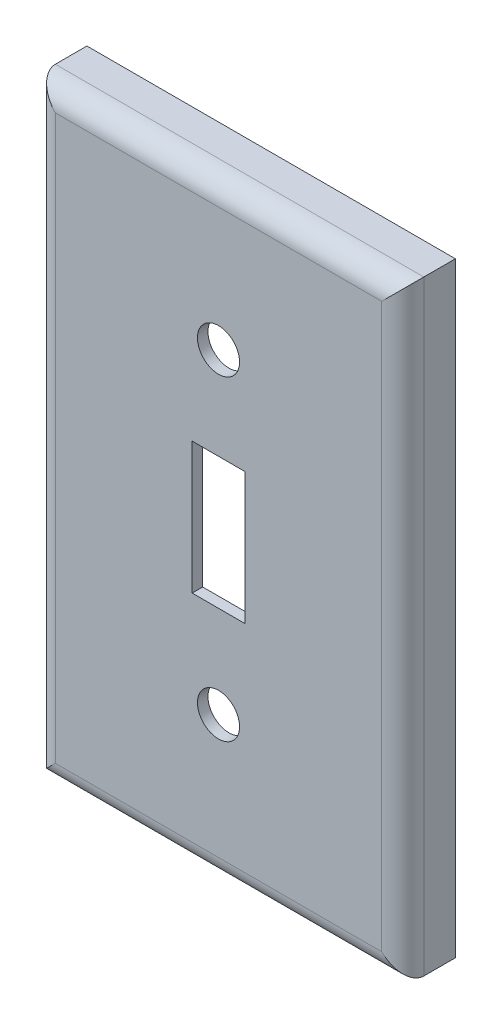
ISO-10303-21;
HEADER;
FILE_DESCRIPTION(('STEP AP214'),'2;1');
FILE_NAME('part.step','',(''),(''),'','','');
FILE_SCHEMA(('AUTOMOTIVE_DESIGN { 1 0 10303 214 1 1 1 1 }'));
ENDSEC;
DATA;
#1=APPLICATION_CONTEXT('core data for automotive mechanical design processes');
#2=APPLICATION_PROTOCOL_DEFINITION('international standard','automotive_design',2000,#1);
#3=PRODUCT_CONTEXT('',#1,'mechanical');
#4=PRODUCT('Part','Part','',(#3));
#5=PRODUCT_RELATED_PRODUCT_CATEGORY('part','',(#4));
#6=PRODUCT_DEFINITION_FORMATION('','',#4);
#7=PRODUCT_DEFINITION_CONTEXT('part definition',#1,'design');
#8=PRODUCT_DEFINITION('design','',#6,#7);
#9=PRODUCT_DEFINITION_SHAPE('','',#8);
#10=(LENGTH_UNIT() NAMED_UNIT(*) SI_UNIT(.MILLI.,.METRE.));
#11=(NAMED_UNIT(*) PLANE_ANGLE_UNIT() SI_UNIT($,.RADIAN.));
#12=(NAMED_UNIT(*) SI_UNIT($,.STERADIAN.) SOLID_ANGLE_UNIT());
#13=UNCERTAINTY_MEASURE_WITH_UNIT(LENGTH_MEASURE(1.E-05),#10,'distance_accuracy_value','');
#14=(GEOMETRIC_REPRESENTATION_CONTEXT(3) GLOBAL_UNCERTAINTY_ASSIGNED_CONTEXT((#13)) GLOBAL_UNIT_ASSIGNED_CONTEXT((#10,
#11,#12)) REPRESENTATION_CONTEXT('',''));
#15=CARTESIAN_POINT('',(0.,0.,0.));
#16=DIRECTION('',(0.,0.,1.));
#17=DIRECTION('',(1.,0.,0.));
#18=AXIS2_PLACEMENT_3D('',#15,#16,#17);
#19=CARTESIAN_POINT('',(0.,0.,0.));
#20=DIRECTION('',(0.,0.,-1.));
#21=DIRECTION('',(-1.,0.,0.));
#22=AXIS2_PLACEMENT_3D('',#19,#20,#21);
#23=PLANE('',#22);
#24=DIRECTION('',(0.,-1.,0.));
#25=VECTOR('',#24,1.);
#26=CARTESIAN_POINT('',(0.,0.,0.));
#27=LINE('',#26,#25);
#28=CARTESIAN_POINT('',(0.,115.,0.));
#29=VERTEX_POINT('',#28);
#30=CARTESIAN_POINT('',(0.,0.,0.));
#31=VERTEX_POINT('',#30);
#32=EDGE_CURVE('E231',#29,#31,#27,.T.);
#33=ORIENTED_EDGE('',*,*,#32,.F.);
#34=DIRECTION('',(-1.,0.,0.));
#35=VECTOR('',#34,1.);
#36=CARTESIAN_POINT('',(0.,115.,0.));
#37=LINE('',#36,#35);
#38=CARTESIAN_POINT('',(70.,115.,0.));
#39=VERTEX_POINT('',#38);
#40=EDGE_CURVE('E241',#39,#29,#37,.T.);
#41=ORIENTED_EDGE('',*,*,#40,.F.);
#42=DIRECTION('',(0.,1.,0.));
#43=VECTOR('',#42,1.);
#44=CARTESIAN_POINT('',(70.,0.,0.));
#45=LINE('',#44,#43);
#46=CARTESIAN_POINT('',(70.,0.,0.));
#47=VERTEX_POINT('',#46);
#48=EDGE_CURVE('E238',#47,#39,#45,.T.);
#49=ORIENTED_EDGE('',*,*,#48,.F.);
#50=DIRECTION('',(1.,0.,0.));
#51=VECTOR('',#50,1.);
#52=CARTESIAN_POINT('',(0.,0.,0.));
#53=LINE('',#52,#51);
#54=EDGE_CURVE('E234',#31,#47,#53,.T.);
#55=ORIENTED_EDGE('',*,*,#54,.F.);
#56=EDGE_LOOP('',(#33,#41,#49,#55));
#57=FACE_BOUND('',#56,.T.);
#58=DIRECTION('',(-1.,0.,0.));
#59=VECTOR('',#58,1.);
#60=CARTESIAN_POINT('',(0.,113.,0.));
#61=LINE('',#60,#59);
#62=CARTESIAN_POINT('',(68.,113.,0.));
#63=VERTEX_POINT('',#62);
#64=CARTESIAN_POINT('',(1.99999999999996,113.,0.));
#65=VERTEX_POINT('',#64);
#66=EDGE_CURVE('E192',#63,#65,#61,.T.);
#67=ORIENTED_EDGE('',*,*,#66,.T.);
#68=DIRECTION('',(0.,-1.,0.));
#69=VECTOR('',#68,1.);
#70=CARTESIAN_POINT('',(2.,0.,0.));
#71=LINE('',#70,#69);
#72=CARTESIAN_POINT('',(2.,2.,0.));
#73=VERTEX_POINT('',#72);
#74=EDGE_CURVE('E206',#65,#73,#71,.T.);
#75=ORIENTED_EDGE('',*,*,#74,.T.);
#76=DIRECTION('',(1.,0.,0.));
#77=VECTOR('',#76,1.);
#78=CARTESIAN_POINT('',(0.,2.,0.));
#79=LINE('',#78,#77);
#80=CARTESIAN_POINT('',(68.,2.,0.));
#81=VERTEX_POINT('',#80);
#82=EDGE_CURVE('E223',#73,#81,#79,.T.);
#83=ORIENTED_EDGE('',*,*,#82,.T.);
#84=DIRECTION('',(0.,1.,0.));
#85=VECTOR('',#84,1.);
#86=CARTESIAN_POINT('',(68.,0.,0.));
#87=LINE('',#86,#85);
#88=EDGE_CURVE('E226',#81,#63,#87,.T.);
#89=ORIENTED_EDGE('',*,*,#88,.T.);
#90=EDGE_LOOP('',(#67,#75,#83,#89));
#91=FACE_BOUND('',#90,.T.);
#92=ADVANCED_FACE('F33',(#57,#91),#23,.T.);
#93=CARTESIAN_POINT('',(0.,0.,10.));
#94=DIRECTION('',(1.,0.,0.));
#95=DIRECTION('',(0.,1.,0.));
#96=AXIS2_PLACEMENT_3D('',#93,#94,#95);
#97=PLANE('',#96);
#98=DIRECTION('',(0.,0.,-1.));
#99=VECTOR('',#98,1.);
#100=CARTESIAN_POINT('',(0.,0.,10.));
#101=LINE('',#100,#99);
#102=CARTESIAN_POINT('',(0.,0.,6.));
#103=VERTEX_POINT('',#102);
#104=EDGE_CURVE('E250',#103,#31,#101,.T.);
#105=ORIENTED_EDGE('',*,*,#104,.F.);
#106=DIRECTION('',(0.,-1.,0.));
#107=VECTOR('',#106,1.);
#108=CARTESIAN_POINT('',(0.,0.,6.));
#109=LINE('',#108,#107);
#110=CARTESIAN_POINT('',(0.,115.,6.));
#111=VERTEX_POINT('',#110);
#112=EDGE_CURVE('E268',#103,#111,#109,.F.);
#113=ORIENTED_EDGE('',*,*,#112,.T.);
#114=DIRECTION('',(0.,0.,-1.));
#115=VECTOR('',#114,1.);
#116=CARTESIAN_POINT('',(0.,115.,10.));
#117=LINE('',#116,#115);
#118=EDGE_CURVE('E244',#111,#29,#117,.T.);
#119=ORIENTED_EDGE('',*,*,#118,.T.);
#120=ORIENTED_EDGE('',*,*,#32,.T.);
#121=EDGE_LOOP('',(#105,#113,#119,#120));
#122=FACE_BOUND('',#121,.T.);
#123=ADVANCED_FACE('F306',(#122),#97,.F.);
#124=CARTESIAN_POINT('',(0.,0.,10.));
#125=DIRECTION('',(0.,1.,0.));
#126=DIRECTION('',(0.,0.,1.));
#127=AXIS2_PLACEMENT_3D('',#124,#125,#126);
#128=PLANE('',#127);
#129=DIRECTION('',(0.,0.,-1.));
#130=VECTOR('',#129,1.);
#131=CARTESIAN_POINT('',(70.,0.,10.));
#132=LINE('',#131,#130);
#133=CARTESIAN_POINT('',(70.,0.,6.));
#134=VERTEX_POINT('',#133);
#135=EDGE_CURVE('E248',#134,#47,#132,.T.);
#136=ORIENTED_EDGE('',*,*,#135,.F.);
#137=DIRECTION('',(1.,0.,0.));
#138=VECTOR('',#137,1.);
#139=CARTESIAN_POINT('',(0.,0.,6.));
#140=LINE('',#139,#138);
#141=EDGE_CURVE('E266',#134,#103,#140,.F.);
#142=ORIENTED_EDGE('',*,*,#141,.T.);
#143=ORIENTED_EDGE('',*,*,#104,.T.);
#144=ORIENTED_EDGE('',*,*,#54,.T.);
#145=EDGE_LOOP('',(#136,#142,#143,#144));
#146=FACE_BOUND('',#145,.T.);
#147=ADVANCED_FACE('F312',(#146),#128,.F.);
#148=CARTESIAN_POINT('',(70.,0.,10.));
#149=DIRECTION('',(-1.,0.,0.));
#150=DIRECTION('',(0.,-1.,0.));
#151=AXIS2_PLACEMENT_3D('',#148,#149,#150);
#152=PLANE('',#151);
#153=DIRECTION('',(0.,0.,-1.));
#154=VECTOR('',#153,1.);
#155=CARTESIAN_POINT('',(70.,115.,10.));
#156=LINE('',#155,#154);
#157=CARTESIAN_POINT('',(70.,115.,6.));
#158=VERTEX_POINT('',#157);
#159=EDGE_CURVE('E246',#158,#39,#156,.T.);
#160=ORIENTED_EDGE('',*,*,#159,.F.);
#161=DIRECTION('',(0.,1.,0.));
#162=VECTOR('',#161,1.);
#163=CARTESIAN_POINT('',(70.,0.,6.));
#164=LINE('',#163,#162);
#165=EDGE_CURVE('E264',#158,#134,#164,.F.);
#166=ORIENTED_EDGE('',*,*,#165,.T.);
#167=ORIENTED_EDGE('',*,*,#135,.T.);
#168=ORIENTED_EDGE('',*,*,#48,.T.);
#169=EDGE_LOOP('',(#160,#166,#167,#168));
#170=FACE_BOUND('',#169,.T.);
#171=ADVANCED_FACE('F323',(#170),#152,.F.);
#172=CARTESIAN_POINT('',(0.,115.,10.));
#173=DIRECTION('',(0.,-1.,0.));
#174=DIRECTION('',(0.,0.,-1.));
#175=AXIS2_PLACEMENT_3D('',#172,#173,#174);
#176=PLANE('',#175);
#177=ORIENTED_EDGE('',*,*,#118,.F.);
#178=DIRECTION('',(-1.,0.,0.));
#179=VECTOR('',#178,1.);
#180=CARTESIAN_POINT('',(0.,115.,6.));
#181=LINE('',#180,#179);
#182=EDGE_CURVE('E261',#111,#158,#181,.F.);
#183=ORIENTED_EDGE('',*,*,#182,.T.);
#184=ORIENTED_EDGE('',*,*,#159,.T.);
#185=ORIENTED_EDGE('',*,*,#40,.T.);
#186=EDGE_LOOP('',(#177,#183,#184,#185));
#187=FACE_BOUND('',#186,.T.);
#188=ADVANCED_FACE('F320',(#187),#176,.F.);
#189=CARTESIAN_POINT('',(0.,0.,10.));
#190=DIRECTION('',(0.,0.,-1.));
#191=DIRECTION('',(-1.,0.,0.));
#192=AXIS2_PLACEMENT_3D('',#189,#190,#191);
#193=PLANE('',#192);
#194=DIRECTION('',(1.,0.,0.));
#195=VECTOR('',#194,1.);
#196=CARTESIAN_POINT('',(30.,45.,10.));
#197=LINE('',#196,#195);
#198=CARTESIAN_POINT('',(30.,45.,10.));
#199=VERTEX_POINT('',#198);
#200=CARTESIAN_POINT('',(40.,45.,10.));
#201=VERTEX_POINT('',#200);
#202=EDGE_CURVE('E157',#199,#201,#197,.T.);
#203=ORIENTED_EDGE('',*,*,#202,.F.);
#204=DIRECTION('',(0.,-1.,0.));
#205=VECTOR('',#204,1.);
#206=CARTESIAN_POINT('',(30.,70.,10.));
#207=LINE('',#206,#205);
#208=CARTESIAN_POINT('',(30.,70.,10.));
#209=VERTEX_POINT('',#208);
#210=EDGE_CURVE('E48',#209,#199,#207,.T.);
#211=ORIENTED_EDGE('',*,*,#210,.F.);
#212=DIRECTION('',(-1.,0.,0.));
#213=VECTOR('',#212,1.);
#214=CARTESIAN_POINT('',(30.,70.,10.));
#215=LINE('',#214,#213);
#216=CARTESIAN_POINT('',(40.,70.,10.));
#217=VERTEX_POINT('',#216);
#218=EDGE_CURVE('E164',#217,#209,#215,.T.);
#219=ORIENTED_EDGE('',*,*,#218,.F.);
#220=DIRECTION('',(0.,1.,0.));
#221=VECTOR('',#220,1.);
#222=CARTESIAN_POINT('',(40.,70.,10.));
#223=LINE('',#222,#221);
#224=EDGE_CURVE('E148',#201,#217,#223,.T.);
#225=ORIENTED_EDGE('',*,*,#224,.F.);
#226=EDGE_LOOP('',(#203,#211,#219,#225));
#227=FACE_BOUND('',#226,.T.);
#228=CARTESIAN_POINT('',(35.,27.5,10.));
#229=DIRECTION('',(0.,0.,1.));
#230=DIRECTION('',(1.,0.,0.));
#231=AXIS2_PLACEMENT_3D('',#228,#229,#230);
#232=CIRCLE('',#231,4.00000000000001);
#233=CARTESIAN_POINT('',(39.,27.5,10.));
#234=VERTEX_POINT('',#233);
#235=EDGE_CURVE('E171',#234,#234,#232,.T.);
#236=ORIENTED_EDGE('',*,*,#235,.F.);
#237=EDGE_LOOP('',(#236));
#238=FACE_BOUND('',#237,.T.);
#239=CARTESIAN_POINT('',(35.,87.5,10.));
#240=DIRECTION('',(0.,0.,1.));
#241=DIRECTION('',(1.,0.,0.));
#242=AXIS2_PLACEMENT_3D('',#239,#240,#241);
#243=CIRCLE('',#242,4.00000000000001);
#244=CARTESIAN_POINT('',(39.,87.5,10.));
#245=VERTEX_POINT('',#244);
#246=EDGE_CURVE('E177',#245,#245,#243,.T.);
#247=ORIENTED_EDGE('',*,*,#246,.F.);
#248=EDGE_LOOP('',(#247));
#249=FACE_BOUND('',#248,.T.);
#250=DIRECTION('',(0.,1.,0.));
#251=VECTOR('',#250,1.);
#252=CARTESIAN_POINT('',(66.,0.,10.));
#253=LINE('',#252,#251);
#254=CARTESIAN_POINT('',(66.,4.,10.));
#255=VERTEX_POINT('',#254);
#256=CARTESIAN_POINT('',(66.,111.,10.));
#257=VERTEX_POINT('',#256);
#258=EDGE_CURVE('E256',#255,#257,#253,.T.);
#259=ORIENTED_EDGE('',*,*,#258,.T.);
#260=DIRECTION('',(-1.,0.,0.));
#261=VECTOR('',#260,1.);
#262=CARTESIAN_POINT('',(0.,111.,10.));
#263=LINE('',#262,#261);
#264=CARTESIAN_POINT('',(3.99999999999996,111.,10.));
#265=VERTEX_POINT('',#264);
#266=EDGE_CURVE('E258',#257,#265,#263,.T.);
#267=ORIENTED_EDGE('',*,*,#266,.T.);
#268=DIRECTION('',(0.,-1.,0.));
#269=VECTOR('',#268,1.);
#270=CARTESIAN_POINT('',(4.,0.,10.));
#271=LINE('',#270,#269);
#272=CARTESIAN_POINT('',(4.,4.,10.));
#273=VERTEX_POINT('',#272);
#274=EDGE_CURVE('E252',#265,#273,#271,.T.);
#275=ORIENTED_EDGE('',*,*,#274,.T.);
#276=DIRECTION('',(1.,0.,0.));
#277=VECTOR('',#276,1.);
#278=CARTESIAN_POINT('',(0.,4.,10.));
#279=LINE('',#278,#277);
#280=EDGE_CURVE('E254',#273,#255,#279,.T.);
#281=ORIENTED_EDGE('',*,*,#280,.T.);
#282=EDGE_LOOP('',(#259,#267,#275,#281));
#283=FACE_BOUND('',#282,.T.);
#284=ADVANCED_FACE('F161',(#227,#238,#249,#283),#193,.F.);
#285=CARTESIAN_POINT('',(0.,4.,6.));
#286=DIRECTION('',(1.,0.,0.));
#287=DIRECTION('',(0.,0.,-1.));
#288=AXIS2_PLACEMENT_3D('',#285,#286,#287);
#289=CYLINDRICAL_SURFACE('',#288,4.);
#290=CARTESIAN_POINT('',(4.,4.,6.));
#291=DIRECTION('',(0.707106781186548,-0.707106781186547,0.));
#292=DIRECTION('',(-0.707106781186547,-0.707106781186548,0.));
#293=AXIS2_PLACEMENT_3D('',#290,#291,#292);
#294=ELLIPSE('',#293,5.65685424949238,4.);
#295=EDGE_CURVE('E274',#103,#273,#294,.F.);
#296=ORIENTED_EDGE('',*,*,#295,.F.);
#297=ORIENTED_EDGE('',*,*,#141,.F.);
#298=CARTESIAN_POINT('',(66.,4.,6.));
#299=DIRECTION('',(0.707106781186547,0.707106781186548,0.));
#300=DIRECTION('',(0.707106781186548,-0.707106781186547,0.));
#301=AXIS2_PLACEMENT_3D('',#298,#299,#300);
#302=ELLIPSE('',#301,5.65685424949238,4.);
#303=EDGE_CURVE('E235',#255,#134,#302,.T.);
#304=ORIENTED_EDGE('',*,*,#303,.F.);
#305=ORIENTED_EDGE('',*,*,#280,.F.);
#306=EDGE_LOOP('',(#296,#297,#304,#305));
#307=FACE_BOUND('',#306,.T.);
#308=ADVANCED_FACE('F35',(#307),#289,.T.);
#309=CARTESIAN_POINT('',(66.,0.,6.));
#310=DIRECTION('',(0.,1.,0.));
#311=DIRECTION('',(-1.,0.,0.));
#312=AXIS2_PLACEMENT_3D('',#309,#310,#311);
#313=CYLINDRICAL_SURFACE('',#312,4.);
#314=ORIENTED_EDGE('',*,*,#303,.T.);
#315=ORIENTED_EDGE('',*,*,#165,.F.);
#316=CARTESIAN_POINT('',(66.,111.,6.));
#317=DIRECTION('',(-0.707106781186548,0.707106781186547,0.));
#318=DIRECTION('',(0.707106781186547,0.707106781186548,0.));
#319=AXIS2_PLACEMENT_3D('',#316,#317,#318);
#320=ELLIPSE('',#319,5.65685424949238,4.);
#321=EDGE_CURVE('E272',#257,#158,#320,.T.);
#322=ORIENTED_EDGE('',*,*,#321,.F.);
#323=ORIENTED_EDGE('',*,*,#258,.F.);
#324=EDGE_LOOP('',(#314,#315,#322,#323));
#325=FACE_BOUND('',#324,.T.);
#326=ADVANCED_FACE('F338',(#325),#313,.T.);
#327=CARTESIAN_POINT('',(4.,0.,6.));
#328=DIRECTION('',(0.,-1.,0.));
#329=DIRECTION('',(1.,0.,0.));
#330=AXIS2_PLACEMENT_3D('',#327,#328,#329);
#331=CYLINDRICAL_SURFACE('',#330,4.);
#332=ORIENTED_EDGE('',*,*,#295,.T.);
#333=ORIENTED_EDGE('',*,*,#274,.F.);
#334=CARTESIAN_POINT('',(3.99999999999996,111.,6.));
#335=DIRECTION('',(-0.707106781186547,-0.707106781186548,0.));
#336=DIRECTION('',(0.707106781186548,-0.707106781186547,0.));
#337=AXIS2_PLACEMENT_3D('',#334,#335,#336);
#338=ELLIPSE('',#337,5.65685424949238,4.);
#339=EDGE_CURVE('E187',#111,#265,#338,.F.);
#340=ORIENTED_EDGE('',*,*,#339,.F.);
#341=ORIENTED_EDGE('',*,*,#112,.F.);
#342=EDGE_LOOP('',(#332,#333,#340,#341));
#343=FACE_BOUND('',#342,.T.);
#344=ADVANCED_FACE('F335',(#343),#331,.T.);
#345=CARTESIAN_POINT('',(0.,111.,6.));
#346=DIRECTION('',(-1.,0.,0.));
#347=DIRECTION('',(0.,0.,1.));
#348=AXIS2_PLACEMENT_3D('',#345,#346,#347);
#349=CYLINDRICAL_SURFACE('',#348,4.);
#350=ORIENTED_EDGE('',*,*,#321,.T.);
#351=ORIENTED_EDGE('',*,*,#182,.F.);
#352=ORIENTED_EDGE('',*,*,#339,.T.);
#353=ORIENTED_EDGE('',*,*,#266,.F.);
#354=EDGE_LOOP('',(#350,#351,#352,#353));
#355=FACE_BOUND('',#354,.T.);
#356=ADVANCED_FACE('F331',(#355),#349,.T.);
#357=CARTESIAN_POINT('',(2.,0.,10.));
#358=DIRECTION('',(1.,0.,0.));
#359=DIRECTION('',(0.,1.,0.));
#360=AXIS2_PLACEMENT_3D('',#357,#358,#359);
#361=PLANE('',#360);
#362=DIRECTION('',(0.,0.,-1.));
#363=VECTOR('',#362,1.);
#364=CARTESIAN_POINT('',(2.,2.,10.));
#365=LINE('',#364,#363);
#366=CARTESIAN_POINT('',(2.,2.,6.));
#367=VERTEX_POINT('',#366);
#368=EDGE_CURVE('E181',#367,#73,#365,.T.);
#369=ORIENTED_EDGE('',*,*,#368,.T.);
#370=ORIENTED_EDGE('',*,*,#74,.F.);
#371=DIRECTION('',(0.,0.,-1.));
#372=VECTOR('',#371,1.);
#373=CARTESIAN_POINT('',(1.99999999999996,113.,10.));
#374=LINE('',#373,#372);
#375=CARTESIAN_POINT('',(1.99999999999996,113.,6.));
#376=VERTEX_POINT('',#375);
#377=EDGE_CURVE('E189',#376,#65,#374,.T.);
#378=ORIENTED_EDGE('',*,*,#377,.F.);
#379=DIRECTION('',(0.,1.,0.));
#380=VECTOR('',#379,1.);
#381=CARTESIAN_POINT('',(2.,0.,6.));
#382=LINE('',#381,#380);
#383=EDGE_CURVE('E185',#367,#376,#382,.T.);
#384=ORIENTED_EDGE('',*,*,#383,.F.);
#385=EDGE_LOOP('',(#369,#370,#378,#384));
#386=FACE_BOUND('',#385,.T.);
#387=ADVANCED_FACE('F334',(#386),#361,.T.);
#388=CARTESIAN_POINT('',(0.,2.,10.));
#389=DIRECTION('',(0.,1.,0.));
#390=DIRECTION('',(0.,0.,1.));
#391=AXIS2_PLACEMENT_3D('',#388,#389,#390);
#392=PLANE('',#391);
#393=DIRECTION('',(0.,0.,-1.));
#394=VECTOR('',#393,1.);
#395=CARTESIAN_POINT('',(68.,2.,10.));
#396=LINE('',#395,#394);
#397=CARTESIAN_POINT('',(68.,2.,6.));
#398=VERTEX_POINT('',#397);
#399=EDGE_CURVE('E184',#398,#81,#396,.T.);
#400=ORIENTED_EDGE('',*,*,#399,.T.);
#401=ORIENTED_EDGE('',*,*,#82,.F.);
#402=ORIENTED_EDGE('',*,*,#368,.F.);
#403=DIRECTION('',(1.,0.,0.));
#404=VECTOR('',#403,1.);
#405=CARTESIAN_POINT('',(0.,2.,6.));
#406=LINE('',#405,#404);
#407=EDGE_CURVE('E188',#398,#367,#406,.F.);
#408=ORIENTED_EDGE('',*,*,#407,.F.);
#409=EDGE_LOOP('',(#400,#401,#402,#408));
#410=FACE_BOUND('',#409,.T.);
#411=ADVANCED_FACE('F409',(#410),#392,.T.);
#412=CARTESIAN_POINT('',(68.,0.,10.));
#413=DIRECTION('',(-1.,0.,0.));
#414=DIRECTION('',(0.,-1.,0.));
#415=AXIS2_PLACEMENT_3D('',#412,#413,#414);
#416=PLANE('',#415);
#417=DIRECTION('',(0.,0.,-1.));
#418=VECTOR('',#417,1.);
#419=CARTESIAN_POINT('',(68.,113.,10.));
#420=LINE('',#419,#418);
#421=CARTESIAN_POINT('',(68.,113.,6.));
#422=VERTEX_POINT('',#421);
#423=EDGE_CURVE('E191',#422,#63,#420,.T.);
#424=ORIENTED_EDGE('',*,*,#423,.T.);
#425=ORIENTED_EDGE('',*,*,#88,.F.);
#426=ORIENTED_EDGE('',*,*,#399,.F.);
#427=DIRECTION('',(0.,-1.,0.));
#428=VECTOR('',#427,1.);
#429=CARTESIAN_POINT('',(68.,0.,6.));
#430=LINE('',#429,#428);
#431=EDGE_CURVE('E196',#422,#398,#430,.T.);
#432=ORIENTED_EDGE('',*,*,#431,.F.);
#433=EDGE_LOOP('',(#424,#425,#426,#432));
#434=FACE_BOUND('',#433,.T.);
#435=ADVANCED_FACE('F419',(#434),#416,.T.);
#436=CARTESIAN_POINT('',(0.,113.,10.));
#437=DIRECTION('',(0.,-1.,0.));
#438=DIRECTION('',(0.,0.,-1.));
#439=AXIS2_PLACEMENT_3D('',#436,#437,#438);
#440=PLANE('',#439);
#441=ORIENTED_EDGE('',*,*,#377,.T.);
#442=ORIENTED_EDGE('',*,*,#66,.F.);
#443=ORIENTED_EDGE('',*,*,#423,.F.);
#444=DIRECTION('',(1.,0.,0.));
#445=VECTOR('',#444,1.);
#446=CARTESIAN_POINT('',(0.,113.,6.));
#447=LINE('',#446,#445);
#448=EDGE_CURVE('E199',#376,#422,#447,.T.);
#449=ORIENTED_EDGE('',*,*,#448,.F.);
#450=EDGE_LOOP('',(#441,#442,#443,#449));
#451=FACE_BOUND('',#450,.T.);
#452=ADVANCED_FACE('F429',(#451),#440,.T.);
#453=CARTESIAN_POINT('',(0.,0.,8.));
#454=DIRECTION('',(0.,0.,-1.));
#455=DIRECTION('',(-1.,0.,0.));
#456=AXIS2_PLACEMENT_3D('',#453,#454,#455);
#457=PLANE('',#456);
#458=DIRECTION('',(0.,1.,0.));
#459=VECTOR('',#458,1.);
#460=CARTESIAN_POINT('',(30.,0.,8.));
#461=LINE('',#460,#459);
#462=CARTESIAN_POINT('',(30.,45.,8.));
#463=VERTEX_POINT('',#462);
#464=CARTESIAN_POINT('',(30.,70.,8.));
#465=VERTEX_POINT('',#464);
#466=EDGE_CURVE('E11',#463,#465,#461,.T.);
#467=ORIENTED_EDGE('',*,*,#466,.F.);
#468=DIRECTION('',(-1.,0.,0.));
#469=VECTOR('',#468,1.);
#470=CARTESIAN_POINT('',(0.,45.,8.));
#471=LINE('',#470,#469);
#472=CARTESIAN_POINT('',(40.,45.,8.));
#473=VERTEX_POINT('',#472);
#474=EDGE_CURVE('E270',#473,#463,#471,.T.);
#475=ORIENTED_EDGE('',*,*,#474,.F.);
#476=DIRECTION('',(0.,-1.,0.));
#477=VECTOR('',#476,1.);
#478=CARTESIAN_POINT('',(40.,0.,8.));
#479=LINE('',#478,#477);
#480=CARTESIAN_POINT('',(40.,70.,8.));
#481=VERTEX_POINT('',#480);
#482=EDGE_CURVE('E151',#481,#473,#479,.T.);
#483=ORIENTED_EDGE('',*,*,#482,.F.);
#484=DIRECTION('',(1.,0.,0.));
#485=VECTOR('',#484,1.);
#486=CARTESIAN_POINT('',(0.,70.,8.));
#487=LINE('',#486,#485);
#488=EDGE_CURVE('E41',#465,#481,#487,.T.);
#489=ORIENTED_EDGE('',*,*,#488,.F.);
#490=EDGE_LOOP('',(#467,#475,#483,#489));
#491=FACE_BOUND('',#490,.T.);
#492=CARTESIAN_POINT('',(35.,27.5,8.));
#493=DIRECTION('',(0.,0.,-1.));
#494=DIRECTION('',(-1.,0.,0.));
#495=AXIS2_PLACEMENT_3D('',#492,#493,#494);
#496=CIRCLE('',#495,4.00000000000001);
#497=CARTESIAN_POINT('',(31.,27.5,8.));
#498=VERTEX_POINT('',#497);
#499=EDGE_CURVE('E176',#498,#498,#496,.T.);
#500=ORIENTED_EDGE('',*,*,#499,.F.);
#501=EDGE_LOOP('',(#500));
#502=FACE_BOUND('',#501,.T.);
#503=CARTESIAN_POINT('',(35.,87.5,8.));
#504=DIRECTION('',(0.,0.,-1.));
#505=DIRECTION('',(-1.,0.,0.));
#506=AXIS2_PLACEMENT_3D('',#503,#504,#505);
#507=CIRCLE('',#506,4.00000000000001);
#508=CARTESIAN_POINT('',(31.,87.5,8.));
#509=VERTEX_POINT('',#508);
#510=EDGE_CURVE('E180',#509,#509,#507,.T.);
#511=ORIENTED_EDGE('',*,*,#510,.F.);
#512=EDGE_LOOP('',(#511));
#513=FACE_BOUND('',#512,.T.);
#514=DIRECTION('',(0.,1.,0.));
#515=VECTOR('',#514,1.);
#516=CARTESIAN_POINT('',(66.,0.,8.));
#517=LINE('',#516,#515);
#518=CARTESIAN_POINT('',(66.,4.,8.));
#519=VERTEX_POINT('',#518);
#520=CARTESIAN_POINT('',(66.,111.,8.));
#521=VERTEX_POINT('',#520);
#522=EDGE_CURVE('E211',#519,#521,#517,.T.);
#523=ORIENTED_EDGE('',*,*,#522,.F.);
#524=DIRECTION('',(-1.,0.,0.));
#525=VECTOR('',#524,1.);
#526=CARTESIAN_POINT('',(0.,4.,8.));
#527=LINE('',#526,#525);
#528=CARTESIAN_POINT('',(4.,4.,8.));
#529=VERTEX_POINT('',#528);
#530=EDGE_CURVE('E213',#529,#519,#527,.F.);
#531=ORIENTED_EDGE('',*,*,#530,.F.);
#532=DIRECTION('',(0.,1.,0.));
#533=VECTOR('',#532,1.);
#534=CARTESIAN_POINT('',(3.99999999999996,0.,8.));
#535=LINE('',#534,#533);
#536=CARTESIAN_POINT('',(3.99999999999996,111.,8.));
#537=VERTEX_POINT('',#536);
#538=EDGE_CURVE('E183',#537,#529,#535,.F.);
#539=ORIENTED_EDGE('',*,*,#538,.F.);
#540=DIRECTION('',(-1.,0.,0.));
#541=VECTOR('',#540,1.);
#542=CARTESIAN_POINT('',(0.,111.,8.));
#543=LINE('',#542,#541);
#544=EDGE_CURVE('E202',#521,#537,#543,.T.);
#545=ORIENTED_EDGE('',*,*,#544,.F.);
#546=EDGE_LOOP('',(#523,#531,#539,#545));
#547=FACE_BOUND('',#546,.T.);
#548=ADVANCED_FACE('F290',(#491,#502,#513,#547),#457,.T.);
#549=CARTESIAN_POINT('',(0.,4.,6.));
#550=DIRECTION('',(1.,0.,0.));
#551=DIRECTION('',(0.,0.,-1.));
#552=AXIS2_PLACEMENT_3D('',#549,#550,#551);
#553=CYLINDRICAL_SURFACE('',#552,2.);
#554=CARTESIAN_POINT('',(4.,4.,6.));
#555=DIRECTION('',(0.707106781186548,-0.707106781186547,0.));
#556=DIRECTION('',(-0.707106781186547,-0.707106781186548,0.));
#557=AXIS2_PLACEMENT_3D('',#554,#555,#556);
#558=ELLIPSE('',#557,2.82842712474619,2.);
#559=EDGE_CURVE('E207',#367,#529,#558,.F.);
#560=ORIENTED_EDGE('',*,*,#559,.T.);
#561=ORIENTED_EDGE('',*,*,#530,.T.);
#562=CARTESIAN_POINT('',(66.,4.,6.));
#563=DIRECTION('',(0.707106781186547,0.707106781186548,0.));
#564=DIRECTION('',(-0.707106781186548,0.707106781186547,0.));
#565=AXIS2_PLACEMENT_3D('',#562,#563,#564);
#566=ELLIPSE('',#565,2.82842712474619,2.);
#567=EDGE_CURVE('E203',#519,#398,#566,.T.);
#568=ORIENTED_EDGE('',*,*,#567,.T.);
#569=ORIENTED_EDGE('',*,*,#407,.T.);
#570=EDGE_LOOP('',(#560,#561,#568,#569));
#571=FACE_BOUND('',#570,.T.);
#572=ADVANCED_FACE('F446',(#571),#553,.F.);
#573=CARTESIAN_POINT('',(66.,0.,6.));
#574=DIRECTION('',(0.,1.,0.));
#575=DIRECTION('',(-1.,0.,0.));
#576=AXIS2_PLACEMENT_3D('',#573,#574,#575);
#577=CYLINDRICAL_SURFACE('',#576,2.);
#578=ORIENTED_EDGE('',*,*,#567,.F.);
#579=ORIENTED_EDGE('',*,*,#522,.T.);
#580=CARTESIAN_POINT('',(66.,111.,6.));
#581=DIRECTION('',(-0.707106781186548,0.707106781186547,0.));
#582=DIRECTION('',(-0.707106781186547,-0.707106781186548,0.));
#583=AXIS2_PLACEMENT_3D('',#580,#581,#582);
#584=ELLIPSE('',#583,2.82842712474619,2.);
#585=EDGE_CURVE('E208',#521,#422,#584,.T.);
#586=ORIENTED_EDGE('',*,*,#585,.T.);
#587=ORIENTED_EDGE('',*,*,#431,.T.);
#588=EDGE_LOOP('',(#578,#579,#586,#587));
#589=FACE_BOUND('',#588,.T.);
#590=ADVANCED_FACE('F451',(#589),#577,.F.);
#591=CARTESIAN_POINT('',(4.,0.,6.));
#592=DIRECTION('',(0.,-1.,0.));
#593=DIRECTION('',(1.,0.,0.));
#594=AXIS2_PLACEMENT_3D('',#591,#592,#593);
#595=CYLINDRICAL_SURFACE('',#594,2.);
#596=ORIENTED_EDGE('',*,*,#559,.F.);
#597=ORIENTED_EDGE('',*,*,#383,.T.);
#598=CARTESIAN_POINT('',(3.99999999999996,111.,6.));
#599=DIRECTION('',(-0.707106781186547,-0.707106781186548,0.));
#600=DIRECTION('',(-0.707106781186548,0.707106781186547,0.));
#601=AXIS2_PLACEMENT_3D('',#598,#599,#600);
#602=ELLIPSE('',#601,2.82842712474619,2.);
#603=EDGE_CURVE('E210',#376,#537,#602,.F.);
#604=ORIENTED_EDGE('',*,*,#603,.T.);
#605=ORIENTED_EDGE('',*,*,#538,.T.);
#606=EDGE_LOOP('',(#596,#597,#604,#605));
#607=FACE_BOUND('',#606,.T.);
#608=ADVANCED_FACE('F461',(#607),#595,.F.);
#609=CARTESIAN_POINT('',(0.,111.,6.));
#610=DIRECTION('',(-1.,0.,0.));
#611=DIRECTION('',(0.,0.,1.));
#612=AXIS2_PLACEMENT_3D('',#609,#610,#611);
#613=CYLINDRICAL_SURFACE('',#612,2.);
#614=ORIENTED_EDGE('',*,*,#585,.F.);
#615=ORIENTED_EDGE('',*,*,#544,.T.);
#616=ORIENTED_EDGE('',*,*,#603,.F.);
#617=ORIENTED_EDGE('',*,*,#448,.T.);
#618=EDGE_LOOP('',(#614,#615,#616,#617));
#619=FACE_BOUND('',#618,.T.);
#620=ADVANCED_FACE('F470',(#619),#613,.F.);
#621=CARTESIAN_POINT('',(35.,87.5,0.));
#622=DIRECTION('',(0.,0.,1.));
#623=DIRECTION('',(1.,0.,0.));
#624=AXIS2_PLACEMENT_3D('',#621,#622,#623);
#625=CYLINDRICAL_SURFACE('',#624,4.00000000000001);
#626=ORIENTED_EDGE('',*,*,#510,.T.);
#627=EDGE_LOOP('',(#626));
#628=FACE_BOUND('',#627,.T.);
#629=ORIENTED_EDGE('',*,*,#246,.T.);
#630=EDGE_LOOP('',(#629));
#631=FACE_BOUND('',#630,.T.);
#632=ADVANCED_FACE('F301',(#628,#631),#625,.F.);
#633=CARTESIAN_POINT('',(35.,27.5,0.));
#634=DIRECTION('',(0.,0.,1.));
#635=DIRECTION('',(1.,0.,0.));
#636=AXIS2_PLACEMENT_3D('',#633,#634,#635);
#637=CYLINDRICAL_SURFACE('',#636,4.00000000000001);
#638=ORIENTED_EDGE('',*,*,#499,.T.);
#639=EDGE_LOOP('',(#638));
#640=FACE_BOUND('',#639,.T.);
#641=ORIENTED_EDGE('',*,*,#235,.T.);
#642=EDGE_LOOP('',(#641));
#643=FACE_BOUND('',#642,.T.);
#644=ADVANCED_FACE('F294',(#640,#643),#637,.F.);
#645=CARTESIAN_POINT('',(30.,70.,0.));
#646=DIRECTION('',(-1.,0.,0.));
#647=DIRECTION('',(0.,-1.,0.));
#648=AXIS2_PLACEMENT_3D('',#645,#646,#647);
#649=PLANE('',#648);
#650=ORIENTED_EDGE('',*,*,#466,.T.);
#651=DIRECTION('',(0.,0.,1.));
#652=VECTOR('',#651,1.);
#653=CARTESIAN_POINT('',(30.,70.,0.));
#654=LINE('',#653,#652);
#655=EDGE_CURVE('E169',#465,#209,#654,.T.);
#656=ORIENTED_EDGE('',*,*,#655,.T.);
#657=ORIENTED_EDGE('',*,*,#210,.T.);
#658=DIRECTION('',(0.,0.,1.));
#659=VECTOR('',#658,1.);
#660=CARTESIAN_POINT('',(30.,45.,0.));
#661=LINE('',#660,#659);
#662=EDGE_CURVE('E154',#463,#199,#661,.T.);
#663=ORIENTED_EDGE('',*,*,#662,.F.);
#664=EDGE_LOOP('',(#650,#656,#657,#663));
#665=FACE_BOUND('',#664,.T.);
#666=ADVANCED_FACE('F292',(#665),#649,.F.);
#667=CARTESIAN_POINT('',(30.,70.,0.));
#668=DIRECTION('',(0.,1.,0.));
#669=DIRECTION('',(0.,0.,1.));
#670=AXIS2_PLACEMENT_3D('',#667,#668,#669);
#671=PLANE('',#670);
#672=ORIENTED_EDGE('',*,*,#488,.T.);
#673=DIRECTION('',(0.,0.,1.));
#674=VECTOR('',#673,1.);
#675=CARTESIAN_POINT('',(40.,70.,0.));
#676=LINE('',#675,#674);
#677=EDGE_CURVE('E153',#481,#217,#676,.T.);
#678=ORIENTED_EDGE('',*,*,#677,.T.);
#679=ORIENTED_EDGE('',*,*,#218,.T.);
#680=ORIENTED_EDGE('',*,*,#655,.F.);
#681=EDGE_LOOP('',(#672,#678,#679,#680));
#682=FACE_BOUND('',#681,.T.);
#683=ADVANCED_FACE('F287',(#682),#671,.F.);
#684=CARTESIAN_POINT('',(40.,70.,0.));
#685=DIRECTION('',(1.,0.,0.));
#686=DIRECTION('',(0.,0.,-1.));
#687=AXIS2_PLACEMENT_3D('',#684,#685,#686);
#688=PLANE('',#687);
#689=ORIENTED_EDGE('',*,*,#482,.T.);
#690=DIRECTION('',(0.,0.,1.));
#691=VECTOR('',#690,1.);
#692=CARTESIAN_POINT('',(40.,45.,0.));
#693=LINE('',#692,#691);
#694=EDGE_CURVE('E56',#473,#201,#693,.T.);
#695=ORIENTED_EDGE('',*,*,#694,.T.);
#696=ORIENTED_EDGE('',*,*,#224,.T.);
#697=ORIENTED_EDGE('',*,*,#677,.F.);
#698=EDGE_LOOP('',(#689,#695,#696,#697));
#699=FACE_BOUND('',#698,.T.);
#700=ADVANCED_FACE('F145',(#699),#688,.F.);
#701=CARTESIAN_POINT('',(30.,45.,0.));
#702=DIRECTION('',(0.,-1.,0.));
#703=DIRECTION('',(0.,0.,-1.));
#704=AXIS2_PLACEMENT_3D('',#701,#702,#703);
#705=PLANE('',#704);
#706=ORIENTED_EDGE('',*,*,#474,.T.);
#707=ORIENTED_EDGE('',*,*,#662,.T.);
#708=ORIENTED_EDGE('',*,*,#202,.T.);
#709=ORIENTED_EDGE('',*,*,#694,.F.);
#710=EDGE_LOOP('',(#706,#707,#708,#709));
#711=FACE_BOUND('',#710,.T.);
#712=ADVANCED_FACE('F158',(#711),#705,.F.);
#713=CLOSED_SHELL('',(#92,#123,#147,#171,#188,#284,#308,#326,#344,#356,#387,#411,#435,#452,#548,
#572,#590,#608,#620,#632,#644,#666,#683,#700,#712));
#714=MANIFOLD_SOLID_BREP('B2',#713);
#715=ADVANCED_BREP_SHAPE_REPRESENTATION('',(#18,#714),#14);
#716=SHAPE_DEFINITION_REPRESENTATION(#9,#715);
ENDSEC;
END-ISO-10303-21;
